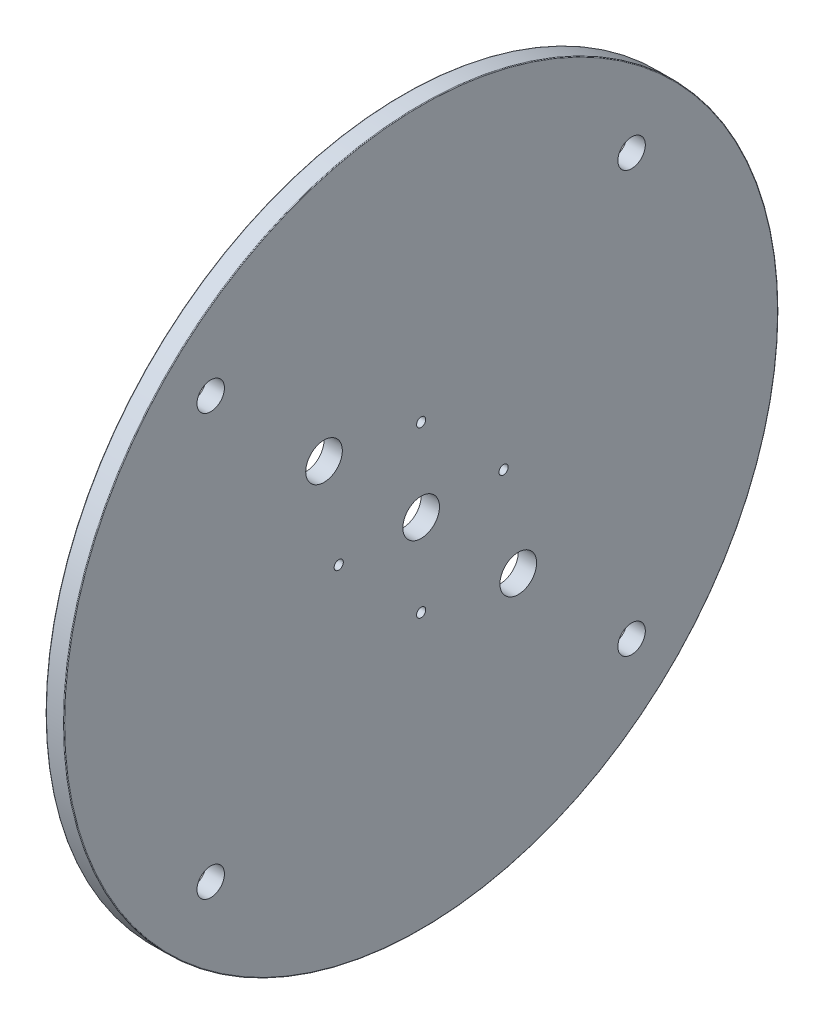
ISO-10303-21;
HEADER;
FILE_DESCRIPTION(('STEP AP214'),'2;1');
FILE_NAME('part.step','',(''),(''),'','','');
FILE_SCHEMA(('AUTOMOTIVE_DESIGN { 1 0 10303 214 1 1 1 1 }'));
ENDSEC;
DATA;
#1=APPLICATION_CONTEXT('core data for automotive mechanical design processes');
#2=APPLICATION_PROTOCOL_DEFINITION('international standard','automotive_design',2000,#1);
#3=PRODUCT_CONTEXT('',#1,'mechanical');
#4=PRODUCT('Part','Part','',(#3));
#5=PRODUCT_RELATED_PRODUCT_CATEGORY('part','',(#4));
#6=PRODUCT_DEFINITION_FORMATION('','',#4);
#7=PRODUCT_DEFINITION_CONTEXT('part definition',#1,'design');
#8=PRODUCT_DEFINITION('design','',#6,#7);
#9=PRODUCT_DEFINITION_SHAPE('','',#8);
#10=(LENGTH_UNIT() NAMED_UNIT(*) SI_UNIT(.MILLI.,.METRE.));
#11=(NAMED_UNIT(*) PLANE_ANGLE_UNIT() SI_UNIT($,.RADIAN.));
#12=(NAMED_UNIT(*) SI_UNIT($,.STERADIAN.) SOLID_ANGLE_UNIT());
#13=UNCERTAINTY_MEASURE_WITH_UNIT(LENGTH_MEASURE(1.E-05),#10,'distance_accuracy_value','');
#14=(GEOMETRIC_REPRESENTATION_CONTEXT(3) GLOBAL_UNCERTAINTY_ASSIGNED_CONTEXT((#13)) GLOBAL_UNIT_ASSIGNED_CONTEXT((#10,
#11,#12)) REPRESENTATION_CONTEXT('',''));
#15=CARTESIAN_POINT('',(0.,0.,0.));
#16=DIRECTION('',(0.,0.,1.));
#17=DIRECTION('',(1.,0.,0.));
#18=AXIS2_PLACEMENT_3D('',#15,#16,#17);
#19=CARTESIAN_POINT('',(8.,0.,0.));
#20=DIRECTION('',(-1.,0.,0.));
#21=DIRECTION('',(0.,0.,1.));
#22=AXIS2_PLACEMENT_3D('',#19,#20,#21);
#23=CYLINDRICAL_SURFACE('',#22,156.);
#24=CARTESIAN_POINT('',(0.3,0.,0.));
#25=DIRECTION('',(1.,0.,0.));
#26=DIRECTION('',(0.,0.,-1.));
#27=AXIS2_PLACEMENT_3D('',#24,#25,#26);
#28=CIRCLE('',#27,156.);
#29=CARTESIAN_POINT('',(0.3,0.,-156.));
#30=VERTEX_POINT('',#29);
#31=EDGE_CURVE('E51',#30,#30,#28,.T.);
#32=ORIENTED_EDGE('',*,*,#31,.T.);
#33=EDGE_LOOP('',(#32));
#34=FACE_BOUND('',#33,.T.);
#35=CARTESIAN_POINT('',(7.7,0.,0.));
#36=DIRECTION('',(1.,0.,0.));
#37=DIRECTION('',(0.,0.,-1.));
#38=AXIS2_PLACEMENT_3D('',#35,#36,#37);
#39=CIRCLE('',#38,156.);
#40=CARTESIAN_POINT('',(7.7,0.,-156.));
#41=VERTEX_POINT('',#40);
#42=EDGE_CURVE('E109',#41,#41,#39,.F.);
#43=ORIENTED_EDGE('',*,*,#42,.T.);
#44=EDGE_LOOP('',(#43));
#45=FACE_BOUND('',#44,.T.);
#46=ADVANCED_FACE('F36',(#34,#45),#23,.T.);
#47=CARTESIAN_POINT('',(8.,0.,0.));
#48=DIRECTION('',(1.,0.,0.));
#49=DIRECTION('',(0.,0.,-1.));
#50=AXIS2_PLACEMENT_3D('',#47,#48,#49);
#51=PLANE('',#50);
#52=CARTESIAN_POINT('',(8.,-36.,1.25693328198353E-13));
#53=DIRECTION('',(1.,0.,0.));
#54=DIRECTION('',(0.,-1.,0.));
#55=AXIS2_PLACEMENT_3D('',#52,#53,#54);
#56=CIRCLE('',#55,2.);
#57=CARTESIAN_POINT('',(8.,-38.,1.32676290876039E-13));
#58=VERTEX_POINT('',#57);
#59=EDGE_CURVE('E197',#58,#58,#56,.T.);
#60=ORIENTED_EDGE('',*,*,#59,.F.);
#61=EDGE_LOOP('',(#60));
#62=FACE_BOUND('',#61,.T.);
#63=CARTESIAN_POINT('',(8.,0.,36.));
#64=DIRECTION('',(1.,0.,0.));
#65=DIRECTION('',(0.,0.,1.));
#66=AXIS2_PLACEMENT_3D('',#63,#64,#65);
#67=CIRCLE('',#66,2.);
#68=CARTESIAN_POINT('',(8.,0.,38.));
#69=VERTEX_POINT('',#68);
#70=EDGE_CURVE('E209',#69,#69,#67,.T.);
#71=ORIENTED_EDGE('',*,*,#70,.F.);
#72=EDGE_LOOP('',(#71));
#73=FACE_BOUND('',#72,.T.);
#74=CARTESIAN_POINT('',(8.,36.,-3.77079984595058E-13));
#75=DIRECTION('',(1.,0.,0.));
#76=DIRECTION('',(0.,1.,0.));
#77=AXIS2_PLACEMENT_3D('',#74,#75,#76);
#78=CIRCLE('',#77,2.);
#79=CARTESIAN_POINT('',(8.,38.,-3.98028872628117E-13));
#80=VERTEX_POINT('',#79);
#81=EDGE_CURVE('E217',#80,#80,#78,.T.);
#82=ORIENTED_EDGE('',*,*,#81,.F.);
#83=EDGE_LOOP('',(#82));
#84=FACE_BOUND('',#83,.T.);
#85=CARTESIAN_POINT('',(8.,0.,-36.));
#86=DIRECTION('',(1.,0.,0.));
#87=DIRECTION('',(0.,0.,-1.));
#88=AXIS2_PLACEMENT_3D('',#85,#86,#87);
#89=CIRCLE('',#88,2.);
#90=CARTESIAN_POINT('',(8.,0.,-38.));
#91=VERTEX_POINT('',#90);
#92=EDGE_CURVE('E78',#91,#91,#89,.T.);
#93=ORIENTED_EDGE('',*,*,#92,.F.);
#94=EDGE_LOOP('',(#93));
#95=FACE_BOUND('',#94,.T.);
#96=CARTESIAN_POINT('',(8.,0.,0.));
#97=DIRECTION('',(1.,0.,0.));
#98=DIRECTION('',(0.,0.,-1.));
#99=AXIS2_PLACEMENT_3D('',#96,#97,#98);
#100=CIRCLE('',#99,8.);
#101=CARTESIAN_POINT('',(8.,0.,-8.));
#102=VERTEX_POINT('',#101);
#103=EDGE_CURVE('E64',#102,#102,#100,.T.);
#104=ORIENTED_EDGE('',*,*,#103,.F.);
#105=EDGE_LOOP('',(#104));
#106=FACE_BOUND('',#105,.T.);
#107=CARTESIAN_POINT('',(8.,42.4264068711929,42.4264068711929));
#108=DIRECTION('',(1.,0.,0.));
#109=DIRECTION('',(0.,0.,1.));
#110=AXIS2_PLACEMENT_3D('',#107,#108,#109);
#111=CIRCLE('',#110,8.);
#112=CARTESIAN_POINT('',(8.,42.4264068711929,50.4264068711929));
#113=VERTEX_POINT('',#112);
#114=EDGE_CURVE('E63',#113,#113,#111,.T.);
#115=ORIENTED_EDGE('',*,*,#114,.F.);
#116=EDGE_LOOP('',(#115));
#117=FACE_BOUND('',#116,.T.);
#118=CARTESIAN_POINT('',(8.,-42.4264068711929,-42.4264068711929));
#119=DIRECTION('',(1.,0.,0.));
#120=DIRECTION('',(0.,0.,-1.));
#121=AXIS2_PLACEMENT_3D('',#118,#119,#120);
#122=CIRCLE('',#121,8.);
#123=CARTESIAN_POINT('',(8.,-42.4264068711929,-50.4264068711929));
#124=VERTEX_POINT('',#123);
#125=EDGE_CURVE('E59',#124,#124,#122,.T.);
#126=ORIENTED_EDGE('',*,*,#125,.F.);
#127=EDGE_LOOP('',(#126));
#128=FACE_BOUND('',#127,.T.);
#129=CARTESIAN_POINT('',(8.,0.,0.));
#130=DIRECTION('',(1.,0.,0.));
#131=DIRECTION('',(0.,0.,-1.));
#132=AXIS2_PLACEMENT_3D('',#129,#130,#131);
#133=CIRCLE('',#132,155.7);
#134=CARTESIAN_POINT('',(8.,0.,-155.7));
#135=VERTEX_POINT('',#134);
#136=EDGE_CURVE('E10',#135,#135,#133,.T.);
#137=ORIENTED_EDGE('',*,*,#136,.T.);
#138=EDGE_LOOP('',(#137));
#139=FACE_BOUND('',#138,.T.);
#140=CARTESIAN_POINT('',(8.,91.9238815542509,91.9238815542515));
#141=DIRECTION('',(1.,0.,0.));
#142=DIRECTION('',(0.,1.,0.));
#143=AXIS2_PLACEMENT_3D('',#140,#141,#142);
#144=CIRCLE('',#143,6.);
#145=CARTESIAN_POINT('',(8.,97.9238815542509,91.9238815542515));
#146=VERTEX_POINT('',#145);
#147=EDGE_CURVE('E88',#146,#146,#144,.T.);
#148=ORIENTED_EDGE('',*,*,#147,.F.);
#149=EDGE_LOOP('',(#148));
#150=FACE_BOUND('',#149,.T.);
#151=CARTESIAN_POINT('',(8.,-91.9238815542512,91.9238815542512));
#152=DIRECTION('',(1.,0.,0.));
#153=DIRECTION('',(0.,0.,1.));
#154=AXIS2_PLACEMENT_3D('',#151,#152,#153);
#155=CIRCLE('',#154,6.);
#156=CARTESIAN_POINT('',(8.,-91.9238815542512,97.9238815542512));
#157=VERTEX_POINT('',#156);
#158=EDGE_CURVE('E93',#157,#157,#155,.T.);
#159=ORIENTED_EDGE('',*,*,#158,.F.);
#160=EDGE_LOOP('',(#159));
#161=FACE_BOUND('',#160,.T.);
#162=CARTESIAN_POINT('',(8.,-91.9238815542502,-91.9238815542521));
#163=DIRECTION('',(1.,0.,0.));
#164=DIRECTION('',(0.,-1.,0.));
#165=AXIS2_PLACEMENT_3D('',#162,#163,#164);
#166=CIRCLE('',#165,6.);
#167=CARTESIAN_POINT('',(8.,-97.9238815542502,-91.9238815542522));
#168=VERTEX_POINT('',#167);
#169=EDGE_CURVE('E58',#168,#168,#166,.T.);
#170=ORIENTED_EDGE('',*,*,#169,.F.);
#171=EDGE_LOOP('',(#170));
#172=FACE_BOUND('',#171,.T.);
#173=CARTESIAN_POINT('',(8.,91.9238815542512,-91.9238815542512));
#174=DIRECTION('',(1.,0.,0.));
#175=DIRECTION('',(0.,0.,-1.));
#176=AXIS2_PLACEMENT_3D('',#173,#174,#175);
#177=CIRCLE('',#176,6.);
#178=CARTESIAN_POINT('',(8.,91.9238815542512,-97.9238815542512));
#179=VERTEX_POINT('',#178);
#180=EDGE_CURVE('E100',#179,#179,#177,.T.);
#181=ORIENTED_EDGE('',*,*,#180,.F.);
#182=EDGE_LOOP('',(#181));
#183=FACE_BOUND('',#182,.T.);
#184=ADVANCED_FACE('F144',(#62,#73,#84,#95,#106,#117,#128,#139,#150,#161,#172,#183),#51,.T.);
#185=CARTESIAN_POINT('',(0.,0.,0.));
#186=DIRECTION('',(1.,0.,0.));
#187=DIRECTION('',(0.,0.,-1.));
#188=AXIS2_PLACEMENT_3D('',#185,#186,#187);
#189=PLANE('',#188);
#190=CARTESIAN_POINT('',(0.,-36.,1.25693328198353E-13));
#191=DIRECTION('',(1.,0.,0.));
#192=DIRECTION('',(0.,-1.,0.));
#193=AXIS2_PLACEMENT_3D('',#190,#191,#192);
#194=CIRCLE('',#193,2.);
#195=CARTESIAN_POINT('',(0.,-38.,1.32676290876039E-13));
#196=VERTEX_POINT('',#195);
#197=EDGE_CURVE('E200',#196,#196,#194,.T.);
#198=ORIENTED_EDGE('',*,*,#197,.T.);
#199=EDGE_LOOP('',(#198));
#200=FACE_BOUND('',#199,.T.);
#201=CARTESIAN_POINT('',(0.,0.,36.));
#202=DIRECTION('',(1.,0.,0.));
#203=DIRECTION('',(0.,0.,1.));
#204=AXIS2_PLACEMENT_3D('',#201,#202,#203);
#205=CIRCLE('',#204,2.);
#206=CARTESIAN_POINT('',(0.,0.,38.));
#207=VERTEX_POINT('',#206);
#208=EDGE_CURVE('E206',#207,#207,#205,.T.);
#209=ORIENTED_EDGE('',*,*,#208,.T.);
#210=EDGE_LOOP('',(#209));
#211=FACE_BOUND('',#210,.T.);
#212=CARTESIAN_POINT('',(0.,36.,-3.77079984595058E-13));
#213=DIRECTION('',(1.,0.,0.));
#214=DIRECTION('',(0.,1.,0.));
#215=AXIS2_PLACEMENT_3D('',#212,#213,#214);
#216=CIRCLE('',#215,2.);
#217=CARTESIAN_POINT('',(0.,38.,-3.98028872628117E-13));
#218=VERTEX_POINT('',#217);
#219=EDGE_CURVE('E213',#218,#218,#216,.T.);
#220=ORIENTED_EDGE('',*,*,#219,.T.);
#221=EDGE_LOOP('',(#220));
#222=FACE_BOUND('',#221,.T.);
#223=CARTESIAN_POINT('',(0.,0.,-36.));
#224=DIRECTION('',(1.,0.,0.));
#225=DIRECTION('',(0.,0.,-1.));
#226=AXIS2_PLACEMENT_3D('',#223,#224,#225);
#227=CIRCLE('',#226,2.);
#228=CARTESIAN_POINT('',(0.,0.,-38.));
#229=VERTEX_POINT('',#228);
#230=EDGE_CURVE('E40',#229,#229,#227,.T.);
#231=ORIENTED_EDGE('',*,*,#230,.T.);
#232=EDGE_LOOP('',(#231));
#233=FACE_BOUND('',#232,.T.);
#234=CARTESIAN_POINT('',(0.,0.,0.));
#235=DIRECTION('',(1.,0.,0.));
#236=DIRECTION('',(0.,0.,-1.));
#237=AXIS2_PLACEMENT_3D('',#234,#235,#236);
#238=CIRCLE('',#237,8.);
#239=CARTESIAN_POINT('',(0.,0.,-8.));
#240=VERTEX_POINT('',#239);
#241=EDGE_CURVE('E60',#240,#240,#238,.T.);
#242=ORIENTED_EDGE('',*,*,#241,.T.);
#243=EDGE_LOOP('',(#242));
#244=FACE_BOUND('',#243,.T.);
#245=CARTESIAN_POINT('',(0.,42.4264068711929,42.4264068711929));
#246=DIRECTION('',(1.,0.,0.));
#247=DIRECTION('',(0.,0.,1.));
#248=AXIS2_PLACEMENT_3D('',#245,#246,#247);
#249=CIRCLE('',#248,8.);
#250=CARTESIAN_POINT('',(0.,42.4264068711929,50.4264068711929));
#251=VERTEX_POINT('',#250);
#252=EDGE_CURVE('E70',#251,#251,#249,.T.);
#253=ORIENTED_EDGE('',*,*,#252,.T.);
#254=EDGE_LOOP('',(#253));
#255=FACE_BOUND('',#254,.T.);
#256=CARTESIAN_POINT('',(0.,-42.4264068711929,-42.4264068711929));
#257=DIRECTION('',(1.,0.,0.));
#258=DIRECTION('',(0.,0.,-1.));
#259=AXIS2_PLACEMENT_3D('',#256,#257,#258);
#260=CIRCLE('',#259,8.);
#261=CARTESIAN_POINT('',(0.,-42.4264068711929,-50.4264068711929));
#262=VERTEX_POINT('',#261);
#263=EDGE_CURVE('E55',#262,#262,#260,.T.);
#264=ORIENTED_EDGE('',*,*,#263,.T.);
#265=EDGE_LOOP('',(#264));
#266=FACE_BOUND('',#265,.T.);
#267=CARTESIAN_POINT('',(0.,0.,0.));
#268=DIRECTION('',(1.,0.,0.));
#269=DIRECTION('',(0.,0.,-1.));
#270=AXIS2_PLACEMENT_3D('',#267,#268,#269);
#271=CIRCLE('',#270,155.7);
#272=CARTESIAN_POINT('',(0.,0.,-155.7));
#273=VERTEX_POINT('',#272);
#274=EDGE_CURVE('E45',#273,#273,#271,.F.);
#275=ORIENTED_EDGE('',*,*,#274,.T.);
#276=EDGE_LOOP('',(#275));
#277=FACE_BOUND('',#276,.T.);
#278=CARTESIAN_POINT('',(0.,91.9238815542509,91.9238815542515));
#279=DIRECTION('',(1.,0.,0.));
#280=DIRECTION('',(0.,0.,-1.));
#281=AXIS2_PLACEMENT_3D('',#278,#279,#280);
#282=CIRCLE('',#281,6.);
#283=CARTESIAN_POINT('',(0.,91.9238815542509,85.9238815542515));
#284=VERTEX_POINT('',#283);
#285=EDGE_CURVE('E105',#284,#284,#282,.T.);
#286=ORIENTED_EDGE('',*,*,#285,.T.);
#287=EDGE_LOOP('',(#286));
#288=FACE_BOUND('',#287,.T.);
#289=CARTESIAN_POINT('',(0.,-91.9238815542512,91.9238815542512));
#290=DIRECTION('',(1.,0.,0.));
#291=DIRECTION('',(0.,0.,-1.));
#292=AXIS2_PLACEMENT_3D('',#289,#290,#291);
#293=CIRCLE('',#292,6.);
#294=CARTESIAN_POINT('',(0.,-91.9238815542512,85.9238815542512));
#295=VERTEX_POINT('',#294);
#296=EDGE_CURVE('E113',#295,#295,#293,.T.);
#297=ORIENTED_EDGE('',*,*,#296,.T.);
#298=EDGE_LOOP('',(#297));
#299=FACE_BOUND('',#298,.T.);
#300=CARTESIAN_POINT('',(0.,-91.9238815542502,-91.9238815542521));
#301=DIRECTION('',(1.,0.,0.));
#302=DIRECTION('',(0.,0.,-1.));
#303=AXIS2_PLACEMENT_3D('',#300,#301,#302);
#304=CIRCLE('',#303,6.);
#305=CARTESIAN_POINT('',(0.,-91.9238815542502,-97.9238815542521));
#306=VERTEX_POINT('',#305);
#307=EDGE_CURVE('E92',#306,#306,#304,.T.);
#308=ORIENTED_EDGE('',*,*,#307,.T.);
#309=EDGE_LOOP('',(#308));
#310=FACE_BOUND('',#309,.T.);
#311=CARTESIAN_POINT('',(0.,91.9238815542512,-91.9238815542512));
#312=DIRECTION('',(1.,0.,0.));
#313=DIRECTION('',(0.,0.,-1.));
#314=AXIS2_PLACEMENT_3D('',#311,#312,#313);
#315=CIRCLE('',#314,6.);
#316=CARTESIAN_POINT('',(0.,91.9238815542512,-97.9238815542512));
#317=VERTEX_POINT('',#316);
#318=EDGE_CURVE('E104',#317,#317,#315,.T.);
#319=ORIENTED_EDGE('',*,*,#318,.T.);
#320=EDGE_LOOP('',(#319));
#321=FACE_BOUND('',#320,.T.);
#322=ADVANCED_FACE('F149',(#200,#211,#222,#233,#244,#255,#266,#277,#288,#299,#310,#321),#189,.F.);
#323=CARTESIAN_POINT('',(-2.,91.9238815542512,-91.9238815542512));
#324=DIRECTION('',(1.,0.,0.));
#325=DIRECTION('',(0.,0.,-1.));
#326=AXIS2_PLACEMENT_3D('',#323,#324,#325);
#327=CYLINDRICAL_SURFACE('',#326,6.);
#328=ORIENTED_EDGE('',*,*,#180,.T.);
#329=EDGE_LOOP('',(#328));
#330=FACE_BOUND('',#329,.T.);
#331=ORIENTED_EDGE('',*,*,#318,.F.);
#332=EDGE_LOOP('',(#331));
#333=FACE_BOUND('',#332,.T.);
#334=ADVANCED_FACE('F154',(#330,#333),#327,.F.);
#335=CARTESIAN_POINT('',(-2.,-91.9238815542502,-91.9238815542521));
#336=DIRECTION('',(1.,0.,0.));
#337=DIRECTION('',(0.,0.,-1.));
#338=AXIS2_PLACEMENT_3D('',#335,#336,#337);
#339=CYLINDRICAL_SURFACE('',#338,6.);
#340=ORIENTED_EDGE('',*,*,#169,.T.);
#341=EDGE_LOOP('',(#340));
#342=FACE_BOUND('',#341,.T.);
#343=ORIENTED_EDGE('',*,*,#307,.F.);
#344=EDGE_LOOP('',(#343));
#345=FACE_BOUND('',#344,.T.);
#346=ADVANCED_FACE('F159',(#342,#345),#339,.F.);
#347=CARTESIAN_POINT('',(-2.,-91.9238815542512,91.9238815542512));
#348=DIRECTION('',(1.,0.,0.));
#349=DIRECTION('',(0.,0.,-1.));
#350=AXIS2_PLACEMENT_3D('',#347,#348,#349);
#351=CYLINDRICAL_SURFACE('',#350,6.);
#352=ORIENTED_EDGE('',*,*,#158,.T.);
#353=EDGE_LOOP('',(#352));
#354=FACE_BOUND('',#353,.T.);
#355=ORIENTED_EDGE('',*,*,#296,.F.);
#356=EDGE_LOOP('',(#355));
#357=FACE_BOUND('',#356,.T.);
#358=ADVANCED_FACE('F138',(#354,#357),#351,.F.);
#359=CARTESIAN_POINT('',(-2.,91.9238815542509,91.9238815542515));
#360=DIRECTION('',(1.,0.,0.));
#361=DIRECTION('',(0.,0.,-1.));
#362=AXIS2_PLACEMENT_3D('',#359,#360,#361);
#363=CYLINDRICAL_SURFACE('',#362,6.);
#364=ORIENTED_EDGE('',*,*,#147,.T.);
#365=EDGE_LOOP('',(#364));
#366=FACE_BOUND('',#365,.T.);
#367=ORIENTED_EDGE('',*,*,#285,.F.);
#368=EDGE_LOOP('',(#367));
#369=FACE_BOUND('',#368,.T.);
#370=ADVANCED_FACE('F130',(#366,#369),#363,.F.);
#371=CARTESIAN_POINT('',(0.3,0.,0.));
#372=DIRECTION('',(1.,0.,0.));
#373=DIRECTION('',(0.,0.,-1.));
#374=AXIS2_PLACEMENT_3D('',#371,#372,#373);
#375=TOROIDAL_SURFACE('',#374,155.7,0.3);
#376=ORIENTED_EDGE('',*,*,#274,.F.);
#377=EDGE_LOOP('',(#376));
#378=FACE_BOUND('',#377,.T.);
#379=ORIENTED_EDGE('',*,*,#31,.F.);
#380=EDGE_LOOP('',(#379));
#381=FACE_BOUND('',#380,.T.);
#382=ADVANCED_FACE('F128',(#378,#381),#375,.T.);
#383=CARTESIAN_POINT('',(7.7,0.,0.));
#384=DIRECTION('',(1.,0.,0.));
#385=DIRECTION('',(0.,0.,-1.));
#386=AXIS2_PLACEMENT_3D('',#383,#384,#385);
#387=TOROIDAL_SURFACE('',#386,155.7,0.3);
#388=ORIENTED_EDGE('',*,*,#42,.F.);
#389=EDGE_LOOP('',(#388));
#390=FACE_BOUND('',#389,.T.);
#391=ORIENTED_EDGE('',*,*,#136,.F.);
#392=EDGE_LOOP('',(#391));
#393=FACE_BOUND('',#392,.T.);
#394=ADVANCED_FACE('F38',(#390,#393),#387,.T.);
#395=CARTESIAN_POINT('',(-2.,-42.4264068711929,-42.4264068711929));
#396=DIRECTION('',(1.,0.,0.));
#397=DIRECTION('',(0.,0.,-1.));
#398=AXIS2_PLACEMENT_3D('',#395,#396,#397);
#399=CYLINDRICAL_SURFACE('',#398,8.);
#400=ORIENTED_EDGE('',*,*,#125,.T.);
#401=EDGE_LOOP('',(#400));
#402=FACE_BOUND('',#401,.T.);
#403=ORIENTED_EDGE('',*,*,#263,.F.);
#404=EDGE_LOOP('',(#403));
#405=FACE_BOUND('',#404,.T.);
#406=ADVANCED_FACE('F136',(#402,#405),#399,.F.);
#407=CARTESIAN_POINT('',(-2.,42.4264068711929,42.4264068711929));
#408=DIRECTION('',(1.,0.,0.));
#409=DIRECTION('',(0.,0.,1.));
#410=AXIS2_PLACEMENT_3D('',#407,#408,#409);
#411=CYLINDRICAL_SURFACE('',#410,8.);
#412=ORIENTED_EDGE('',*,*,#114,.T.);
#413=EDGE_LOOP('',(#412));
#414=FACE_BOUND('',#413,.T.);
#415=ORIENTED_EDGE('',*,*,#252,.F.);
#416=EDGE_LOOP('',(#415));
#417=FACE_BOUND('',#416,.T.);
#418=ADVANCED_FACE('F169',(#414,#417),#411,.F.);
#419=CARTESIAN_POINT('',(-2.,0.,0.));
#420=DIRECTION('',(1.,0.,0.));
#421=DIRECTION('',(0.,0.,-1.));
#422=AXIS2_PLACEMENT_3D('',#419,#420,#421);
#423=CYLINDRICAL_SURFACE('',#422,8.);
#424=ORIENTED_EDGE('',*,*,#103,.T.);
#425=EDGE_LOOP('',(#424));
#426=FACE_BOUND('',#425,.T.);
#427=ORIENTED_EDGE('',*,*,#241,.F.);
#428=EDGE_LOOP('',(#427));
#429=FACE_BOUND('',#428,.T.);
#430=ADVANCED_FACE('F173',(#426,#429),#423,.F.);
#431=CARTESIAN_POINT('',(-2.,0.,-36.));
#432=DIRECTION('',(1.,0.,0.));
#433=DIRECTION('',(0.,0.,-1.));
#434=AXIS2_PLACEMENT_3D('',#431,#432,#433);
#435=CYLINDRICAL_SURFACE('',#434,2.);
#436=ORIENTED_EDGE('',*,*,#92,.T.);
#437=EDGE_LOOP('',(#436));
#438=FACE_BOUND('',#437,.T.);
#439=ORIENTED_EDGE('',*,*,#230,.F.);
#440=EDGE_LOOP('',(#439));
#441=FACE_BOUND('',#440,.T.);
#442=ADVANCED_FACE('F177',(#438,#441),#435,.F.);
#443=CARTESIAN_POINT('',(-2.,36.,-3.77079984595058E-13));
#444=DIRECTION('',(1.,0.,0.));
#445=DIRECTION('',(0.,1.,0.));
#446=AXIS2_PLACEMENT_3D('',#443,#444,#445);
#447=CYLINDRICAL_SURFACE('',#446,2.);
#448=ORIENTED_EDGE('',*,*,#81,.T.);
#449=EDGE_LOOP('',(#448));
#450=FACE_BOUND('',#449,.T.);
#451=ORIENTED_EDGE('',*,*,#219,.F.);
#452=EDGE_LOOP('',(#451));
#453=FACE_BOUND('',#452,.T.);
#454=ADVANCED_FACE('F180',(#450,#453),#447,.F.);
#455=CARTESIAN_POINT('',(-2.,0.,36.));
#456=DIRECTION('',(1.,0.,0.));
#457=DIRECTION('',(0.,0.,1.));
#458=AXIS2_PLACEMENT_3D('',#455,#456,#457);
#459=CYLINDRICAL_SURFACE('',#458,2.);
#460=ORIENTED_EDGE('',*,*,#70,.T.);
#461=EDGE_LOOP('',(#460));
#462=FACE_BOUND('',#461,.T.);
#463=ORIENTED_EDGE('',*,*,#208,.F.);
#464=EDGE_LOOP('',(#463));
#465=FACE_BOUND('',#464,.T.);
#466=ADVANCED_FACE('F184',(#462,#465),#459,.F.);
#467=CARTESIAN_POINT('',(-2.,-36.,1.25693328198353E-13));
#468=DIRECTION('',(1.,0.,0.));
#469=DIRECTION('',(0.,-1.,0.));
#470=AXIS2_PLACEMENT_3D('',#467,#468,#469);
#471=CYLINDRICAL_SURFACE('',#470,2.);
#472=ORIENTED_EDGE('',*,*,#59,.T.);
#473=EDGE_LOOP('',(#472));
#474=FACE_BOUND('',#473,.T.);
#475=ORIENTED_EDGE('',*,*,#197,.F.);
#476=EDGE_LOOP('',(#475));
#477=FACE_BOUND('',#476,.T.);
#478=ADVANCED_FACE('F188',(#474,#477),#471,.F.);
#479=CLOSED_SHELL('',(#46,#184,#322,#334,#346,#358,#370,#382,#394,#406,#418,#430,#442,#454,#466,#478));
#480=MANIFOLD_SOLID_BREP('B2',#479);
#481=ADVANCED_BREP_SHAPE_REPRESENTATION('',(#18,#480),#14);
#482=SHAPE_DEFINITION_REPRESENTATION(#9,#481);
ENDSEC;
END-ISO-10303-21;
